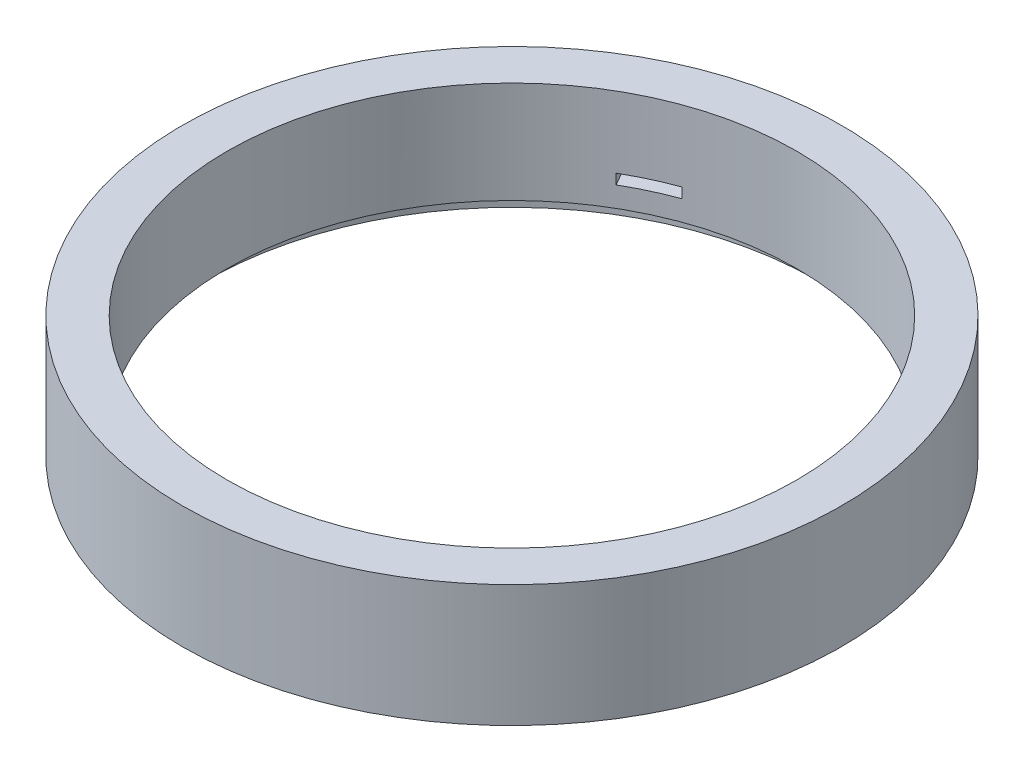
ISO-10303-21;
HEADER;
FILE_DESCRIPTION(('STEP AP214'),'2;1');
FILE_NAME('part.step','',(''),(''),'','','');
FILE_SCHEMA(('AUTOMOTIVE_DESIGN { 1 0 10303 214 1 1 1 1 }'));
ENDSEC;
DATA;
#1=APPLICATION_CONTEXT('core data for automotive mechanical design processes');
#2=APPLICATION_PROTOCOL_DEFINITION('international standard','automotive_design',2000,#1);
#3=PRODUCT_CONTEXT('',#1,'mechanical');
#4=PRODUCT('Part','Part','',(#3));
#5=PRODUCT_RELATED_PRODUCT_CATEGORY('part','',(#4));
#6=PRODUCT_DEFINITION_FORMATION('','',#4);
#7=PRODUCT_DEFINITION_CONTEXT('part definition',#1,'design');
#8=PRODUCT_DEFINITION('design','',#6,#7);
#9=PRODUCT_DEFINITION_SHAPE('','',#8);
#10=(LENGTH_UNIT() NAMED_UNIT(*) SI_UNIT(.MILLI.,.METRE.));
#11=(NAMED_UNIT(*) PLANE_ANGLE_UNIT() SI_UNIT($,.RADIAN.));
#12=(NAMED_UNIT(*) SI_UNIT($,.STERADIAN.) SOLID_ANGLE_UNIT());
#13=UNCERTAINTY_MEASURE_WITH_UNIT(LENGTH_MEASURE(1.E-05),#10,'distance_accuracy_value','');
#14=(GEOMETRIC_REPRESENTATION_CONTEXT(3) GLOBAL_UNCERTAINTY_ASSIGNED_CONTEXT((#13)) GLOBAL_UNIT_ASSIGNED_CONTEXT((#10,
#11,#12)) REPRESENTATION_CONTEXT('',''));
#15=CARTESIAN_POINT('',(0.,0.,0.));
#16=DIRECTION('',(0.,0.,1.));
#17=DIRECTION('',(1.,0.,0.));
#18=AXIS2_PLACEMENT_3D('',#15,#16,#17);
#19=CARTESIAN_POINT('',(0.,15.,0.));
#20=DIRECTION('',(0.,-1.,0.));
#21=DIRECTION('',(0.,0.,-1.));
#22=AXIS2_PLACEMENT_3D('',#19,#20,#21);
#23=CYLINDRICAL_SURFACE('',#22,70.);
#24=DIRECTION('',(0.,-1.,0.));
#25=VECTOR('',#24,1.);
#26=CARTESIAN_POINT('',(-35.0000000000003,15.,-60.6217782649106));
#27=LINE('',#26,#25);
#28=CARTESIAN_POINT('',(-35.0000000000003,-2.50000000000001,-60.6217782649106));
#29=VERTEX_POINT('',#28);
#30=CARTESIAN_POINT('',(-35.0000000000003,-5.00000000000001,-60.6217782649106));
#31=VERTEX_POINT('',#30);
#32=EDGE_CURVE('E139',#29,#31,#27,.T.);
#33=ORIENTED_EDGE('',*,*,#32,.F.);
#34=CARTESIAN_POINT('',(0.,-2.50000000000001,0.));
#35=DIRECTION('',(0.,-1.,0.));
#36=DIRECTION('',(-0.866025403784436,0.,0.500000000000004));
#37=AXIS2_PLACEMENT_3D('',#34,#35,#36);
#38=CIRCLE('',#37,70.);
#39=CARTESIAN_POINT('',(-23.9414100327971,-2.50000000000001,-65.7784834550135));
#40=VERTEX_POINT('',#39);
#41=EDGE_CURVE('E64',#29,#40,#38,.T.);
#42=ORIENTED_EDGE('',*,*,#41,.T.);
#43=DIRECTION('',(0.,-1.,0.));
#44=VECTOR('',#43,1.);
#45=CARTESIAN_POINT('',(-23.9414100327971,15.,-65.7784834550135));
#46=LINE('',#45,#44);
#47=CARTESIAN_POINT('',(-23.9414100327971,-5.00000000000001,-65.7784834550135));
#48=VERTEX_POINT('',#47);
#49=EDGE_CURVE('E162',#40,#48,#46,.T.);
#50=ORIENTED_EDGE('',*,*,#49,.T.);
#51=CARTESIAN_POINT('',(0.,-5.00000000000001,0.));
#52=DIRECTION('',(0.,1.,0.));
#53=DIRECTION('',(0.866025403784436,0.,-0.500000000000004));
#54=AXIS2_PLACEMENT_3D('',#51,#52,#53);
#55=CIRCLE('',#54,70.);
#56=EDGE_CURVE('E153',#48,#31,#55,.T.);
#57=ORIENTED_EDGE('',*,*,#56,.T.);
#58=EDGE_LOOP('',(#33,#42,#50,#57));
#59=FACE_BOUND('',#58,.T.);
#60=DIRECTION('',(0.,-1.,0.));
#61=VECTOR('',#60,1.);
#62=CARTESIAN_POINT('',(-34.9999999999994,15.,60.621778264911));
#63=LINE('',#62,#61);
#64=CARTESIAN_POINT('',(-34.9999999999994,-2.50000000000001,60.621778264911));
#65=VERTEX_POINT('',#64);
#66=CARTESIAN_POINT('',(-34.9999999999994,-5.00000000000001,60.621778264911));
#67=VERTEX_POINT('',#66);
#68=EDGE_CURVE('E186',#65,#67,#63,.T.);
#69=ORIENTED_EDGE('',*,*,#68,.F.);
#70=CARTESIAN_POINT('',(0.,-2.50000000000001,0.));
#71=DIRECTION('',(0.,-1.,0.));
#72=DIRECTION('',(0.866025403784443,0.,0.499999999999992));
#73=AXIS2_PLACEMENT_3D('',#70,#71,#72);
#74=CIRCLE('',#73,70.);
#75=CARTESIAN_POINT('',(-44.9951326780573,-2.50000000000001,53.6231110183289));
#76=VERTEX_POINT('',#75);
#77=EDGE_CURVE('E72',#65,#76,#74,.T.);
#78=ORIENTED_EDGE('',*,*,#77,.T.);
#79=DIRECTION('',(0.,-1.,0.));
#80=VECTOR('',#79,1.);
#81=CARTESIAN_POINT('',(-44.9951326780573,15.,53.6231110183289));
#82=LINE('',#81,#80);
#83=CARTESIAN_POINT('',(-44.9951326780573,-5.00000000000001,53.6231110183289));
#84=VERTEX_POINT('',#83);
#85=EDGE_CURVE('E216',#76,#84,#82,.T.);
#86=ORIENTED_EDGE('',*,*,#85,.T.);
#87=CARTESIAN_POINT('',(0.,-5.00000000000001,0.));
#88=DIRECTION('',(0.,1.,0.));
#89=DIRECTION('',(-0.866025403784443,0.,-0.499999999999992));
#90=AXIS2_PLACEMENT_3D('',#87,#88,#89);
#91=CIRCLE('',#90,70.);
#92=EDGE_CURVE('E205',#84,#67,#91,.T.);
#93=ORIENTED_EDGE('',*,*,#92,.T.);
#94=EDGE_LOOP('',(#69,#78,#86,#93));
#95=FACE_BOUND('',#94,.T.);
#96=CARTESIAN_POINT('',(0.,-2.50000000000001,0.));
#97=DIRECTION('',(0.,-1.,0.));
#98=DIRECTION('',(0.,0.,-1.));
#99=AXIS2_PLACEMENT_3D('',#96,#97,#98);
#100=CIRCLE('',#99,70.);
#101=CARTESIAN_POINT('',(70.,-2.50000000000001,0.));
#102=VERTEX_POINT('',#101);
#103=CARTESIAN_POINT('',(68.9365427108546,-2.50000000000001,12.1553724366852));
#104=VERTEX_POINT('',#103);
#105=EDGE_CURVE('E57',#102,#104,#100,.T.);
#106=ORIENTED_EDGE('',*,*,#105,.T.);
#107=DIRECTION('',(0.,-1.,0.));
#108=VECTOR('',#107,1.);
#109=CARTESIAN_POINT('',(68.9365427108546,15.,12.1553724366852));
#110=LINE('',#109,#108);
#111=CARTESIAN_POINT('',(68.9365427108546,-5.00000000000001,12.1553724366852));
#112=VERTEX_POINT('',#111);
#113=EDGE_CURVE('E11',#104,#112,#110,.T.);
#114=ORIENTED_EDGE('',*,*,#113,.T.);
#115=CARTESIAN_POINT('',(0.,-5.00000000000001,0.));
#116=DIRECTION('',(0.,1.,0.));
#117=DIRECTION('',(0.,0.,1.));
#118=AXIS2_PLACEMENT_3D('',#115,#116,#117);
#119=CIRCLE('',#118,70.);
#120=CARTESIAN_POINT('',(70.,-5.00000000000001,0.));
#121=VERTEX_POINT('',#120);
#122=EDGE_CURVE('E268',#112,#121,#119,.T.);
#123=ORIENTED_EDGE('',*,*,#122,.T.);
#124=DIRECTION('',(0.,-1.,0.));
#125=VECTOR('',#124,1.);
#126=CARTESIAN_POINT('',(70.,15.,0.));
#127=LINE('',#126,#125);
#128=EDGE_CURVE('E262',#102,#121,#127,.T.);
#129=ORIENTED_EDGE('',*,*,#128,.F.);
#130=EDGE_LOOP('',(#106,#114,#123,#129));
#131=FACE_BOUND('',#130,.T.);
#132=CARTESIAN_POINT('',(0.,15.,0.));
#133=DIRECTION('',(0.,1.,0.));
#134=DIRECTION('',(0.,0.,1.));
#135=AXIS2_PLACEMENT_3D('',#132,#133,#134);
#136=CIRCLE('',#135,70.);
#137=CARTESIAN_POINT('',(0.,15.,70.));
#138=VERTEX_POINT('',#137);
#139=EDGE_CURVE('E253',#138,#138,#136,.T.);
#140=ORIENTED_EDGE('',*,*,#139,.T.);
#141=EDGE_LOOP('',(#140));
#142=FACE_BOUND('',#141,.T.);
#143=CARTESIAN_POINT('',(0.,-10.,0.));
#144=DIRECTION('',(0.,-1.,0.));
#145=DIRECTION('',(0.,0.,-1.));
#146=AXIS2_PLACEMENT_3D('',#143,#144,#145);
#147=CIRCLE('',#146,70.);
#148=CARTESIAN_POINT('',(0.,-10.,-70.));
#149=VERTEX_POINT('',#148);
#150=EDGE_CURVE('E51',#149,#149,#147,.T.);
#151=ORIENTED_EDGE('',*,*,#150,.T.);
#152=EDGE_LOOP('',(#151));
#153=FACE_BOUND('',#152,.T.);
#154=ADVANCED_FACE('F47',(#59,#95,#131,#142,#153),#23,.F.);
#155=CARTESIAN_POINT('',(0.,15.,0.));
#156=DIRECTION('',(0.,1.,0.));
#157=DIRECTION('',(0.,0.,1.));
#158=AXIS2_PLACEMENT_3D('',#155,#156,#157);
#159=PLANE('',#158);
#160=CARTESIAN_POINT('',(0.,15.,0.));
#161=DIRECTION('',(0.,1.,0.));
#162=DIRECTION('',(0.,0.,1.));
#163=AXIS2_PLACEMENT_3D('',#160,#161,#162);
#164=CIRCLE('',#163,81.);
#165=CARTESIAN_POINT('',(0.,15.,81.));
#166=VERTEX_POINT('',#165);
#167=EDGE_CURVE('E258',#166,#166,#164,.T.);
#168=ORIENTED_EDGE('',*,*,#167,.T.);
#169=EDGE_LOOP('',(#168));
#170=FACE_BOUND('',#169,.T.);
#171=ORIENTED_EDGE('',*,*,#139,.F.);
#172=EDGE_LOOP('',(#171));
#173=FACE_BOUND('',#172,.T.);
#174=ADVANCED_FACE('F306',(#170,#173),#159,.T.);
#175=CARTESIAN_POINT('',(0.,-15.,0.));
#176=DIRECTION('',(0.,1.,0.));
#177=DIRECTION('',(0.,0.,1.));
#178=AXIS2_PLACEMENT_3D('',#175,#176,#177);
#179=PLANE('',#178);
#180=CARTESIAN_POINT('',(0.,-15.,0.));
#181=DIRECTION('',(0.,-1.,0.));
#182=DIRECTION('',(0.,0.,-1.));
#183=AXIS2_PLACEMENT_3D('',#180,#181,#182);
#184=CIRCLE('',#183,75.);
#185=CARTESIAN_POINT('',(0.,-15.,-75.));
#186=VERTEX_POINT('',#185);
#187=EDGE_CURVE('E325',#186,#186,#184,.T.);
#188=ORIENTED_EDGE('',*,*,#187,.F.);
#189=EDGE_LOOP('',(#188));
#190=FACE_BOUND('',#189,.T.);
#191=CARTESIAN_POINT('',(0.,-15.,0.));
#192=DIRECTION('',(0.,1.,0.));
#193=DIRECTION('',(0.,0.,1.));
#194=AXIS2_PLACEMENT_3D('',#191,#192,#193);
#195=CIRCLE('',#194,81.);
#196=CARTESIAN_POINT('',(0.,-15.,81.));
#197=VERTEX_POINT('',#196);
#198=EDGE_CURVE('E257',#197,#197,#195,.T.);
#199=ORIENTED_EDGE('',*,*,#198,.F.);
#200=EDGE_LOOP('',(#199));
#201=FACE_BOUND('',#200,.T.);
#202=ADVANCED_FACE('F311',(#190,#201),#179,.F.);
#203=CARTESIAN_POINT('',(0.,15.,0.));
#204=DIRECTION('',(0.,-1.,0.));
#205=DIRECTION('',(0.,0.,-1.));
#206=AXIS2_PLACEMENT_3D('',#203,#204,#205);
#207=CYLINDRICAL_SURFACE('',#206,81.);
#208=ORIENTED_EDGE('',*,*,#167,.F.);
#209=EDGE_LOOP('',(#208));
#210=FACE_BOUND('',#209,.T.);
#211=ORIENTED_EDGE('',*,*,#198,.T.);
#212=EDGE_LOOP('',(#211));
#213=FACE_BOUND('',#212,.T.);
#214=ADVANCED_FACE('F49',(#210,#213),#207,.T.);
#215=CARTESIAN_POINT('',(68.9349764855042,-2.50000000000001,12.155096268898));
#216=DIRECTION('',(0.,-1.,0.));
#217=DIRECTION('',(0.,0.,-1.));
#218=AXIS2_PLACEMENT_3D('',#215,#216,#217);
#219=PLANE('',#218);
#220=DIRECTION('',(-1.,0.,0.));
#221=VECTOR('',#220,1.);
#222=CARTESIAN_POINT('',(69.998409613099,-2.50000000000001,0.));
#223=LINE('',#222,#221);
#224=CARTESIAN_POINT('',(74.998409613099,-2.50000000000001,0.));
#225=VERTEX_POINT('',#224);
#226=EDGE_CURVE('E232',#225,#102,#223,.T.);
#227=ORIENTED_EDGE('',*,*,#226,.F.);
#228=CARTESIAN_POINT('',(0.,-2.50000000000001,0.));
#229=DIRECTION('',(0.,1.,0.));
#230=DIRECTION('',(0.,0.,1.));
#231=AXIS2_PLACEMENT_3D('',#228,#229,#230);
#232=CIRCLE('',#231,74.998409613099);
#233=CARTESIAN_POINT('',(73.8590152505652,-2.50000000000001,13.0233371572327));
#234=VERTEX_POINT('',#233);
#235=EDGE_CURVE('E250',#234,#225,#232,.T.);
#236=ORIENTED_EDGE('',*,*,#235,.F.);
#237=DIRECTION('',(-0.984807753012208,0.,-0.173648177666931));
#238=VECTOR('',#237,1.);
#239=CARTESIAN_POINT('',(68.9349764855042,-2.50000000000001,12.155096268898));
#240=LINE('',#239,#238);
#241=EDGE_CURVE('E242',#234,#104,#240,.T.);
#242=ORIENTED_EDGE('',*,*,#241,.T.);
#243=ORIENTED_EDGE('',*,*,#105,.F.);
#244=EDGE_LOOP('',(#227,#236,#242,#243));
#245=FACE_BOUND('',#244,.T.);
#246=ADVANCED_FACE('F280',(#245),#219,.T.);
#247=CARTESIAN_POINT('',(0.,15.,0.));
#248=DIRECTION('',(0.,1.,0.));
#249=DIRECTION('',(0.,0.,1.));
#250=AXIS2_PLACEMENT_3D('',#247,#248,#249);
#251=CYLINDRICAL_SURFACE('',#250,74.998409613099);
#252=CARTESIAN_POINT('',(0.,-5.00000000000001,0.));
#253=DIRECTION('',(0.,1.,0.));
#254=DIRECTION('',(0.,0.,1.));
#255=AXIS2_PLACEMENT_3D('',#252,#253,#254);
#256=CIRCLE('',#255,74.998409613099);
#257=CARTESIAN_POINT('',(73.8590152505652,-5.00000000000001,13.0233371572327));
#258=VERTEX_POINT('',#257);
#259=CARTESIAN_POINT('',(74.998409613099,-5.00000000000001,0.));
#260=VERTEX_POINT('',#259);
#261=EDGE_CURVE('E246',#258,#260,#256,.T.);
#262=ORIENTED_EDGE('',*,*,#261,.F.);
#263=DIRECTION('',(0.,1.,0.));
#264=VECTOR('',#263,1.);
#265=CARTESIAN_POINT('',(73.8590152505652,-5.00000000000001,13.0233371572327));
#266=LINE('',#265,#264);
#267=EDGE_CURVE('E238',#258,#234,#266,.T.);
#268=ORIENTED_EDGE('',*,*,#267,.T.);
#269=ORIENTED_EDGE('',*,*,#235,.T.);
#270=DIRECTION('',(0.,1.,0.));
#271=VECTOR('',#270,1.);
#272=CARTESIAN_POINT('',(74.998409613099,-5.00000000000001,0.));
#273=LINE('',#272,#271);
#274=EDGE_CURVE('E228',#260,#225,#273,.T.);
#275=ORIENTED_EDGE('',*,*,#274,.F.);
#276=EDGE_LOOP('',(#262,#268,#269,#275));
#277=FACE_BOUND('',#276,.T.);
#278=ADVANCED_FACE('F292',(#277),#251,.F.);
#279=CARTESIAN_POINT('',(68.9349764855042,-5.00000000000001,12.155096268898));
#280=DIRECTION('',(0.,1.,0.));
#281=DIRECTION('',(0.,0.,1.));
#282=AXIS2_PLACEMENT_3D('',#279,#280,#281);
#283=PLANE('',#282);
#284=DIRECTION('',(0.984807753012208,0.,0.173648177666931));
#285=VECTOR('',#284,1.);
#286=CARTESIAN_POINT('',(68.9349764855042,-5.00000000000001,12.155096268898));
#287=LINE('',#286,#285);
#288=EDGE_CURVE('E235',#112,#258,#287,.T.);
#289=ORIENTED_EDGE('',*,*,#288,.T.);
#290=ORIENTED_EDGE('',*,*,#261,.T.);
#291=DIRECTION('',(1.,0.,0.));
#292=VECTOR('',#291,1.);
#293=CARTESIAN_POINT('',(69.998409613099,-5.00000000000001,0.));
#294=LINE('',#293,#292);
#295=EDGE_CURVE('E185',#121,#260,#294,.T.);
#296=ORIENTED_EDGE('',*,*,#295,.F.);
#297=ORIENTED_EDGE('',*,*,#122,.F.);
#298=EDGE_LOOP('',(#289,#290,#296,#297));
#299=FACE_BOUND('',#298,.T.);
#300=ADVANCED_FACE('F288',(#299),#283,.T.);
#301=CARTESIAN_POINT('',(0.,0.,0.));
#302=DIRECTION('',(0.173648177666931,0.,-0.984807753012208));
#303=DIRECTION('',(-0.984807753012208,0.,-0.173648177666931));
#304=AXIS2_PLACEMENT_3D('',#301,#302,#303);
#305=PLANE('',#304);
#306=ORIENTED_EDGE('',*,*,#241,.F.);
#307=ORIENTED_EDGE('',*,*,#267,.F.);
#308=ORIENTED_EDGE('',*,*,#288,.F.);
#309=ORIENTED_EDGE('',*,*,#113,.F.);
#310=EDGE_LOOP('',(#306,#307,#308,#309));
#311=FACE_BOUND('',#310,.T.);
#312=ADVANCED_FACE('F284',(#311),#305,.T.);
#313=CARTESIAN_POINT('',(0.,0.,0.));
#314=DIRECTION('',(0.,0.,-1.));
#315=DIRECTION('',(-1.,0.,0.));
#316=AXIS2_PLACEMENT_3D('',#313,#314,#315);
#317=PLANE('',#316);
#318=ORIENTED_EDGE('',*,*,#128,.T.);
#319=ORIENTED_EDGE('',*,*,#295,.T.);
#320=ORIENTED_EDGE('',*,*,#274,.T.);
#321=ORIENTED_EDGE('',*,*,#226,.T.);
#322=EDGE_LOOP('',(#318,#319,#320,#321));
#323=FACE_BOUND('',#322,.T.);
#324=ADVANCED_FACE('F294',(#323),#317,.F.);
#325=CARTESIAN_POINT('',(-44.9941103970627,-2.50000000000001,53.621892711281));
#326=DIRECTION('',(0.,-1.,0.));
#327=DIRECTION('',(0.866025403784443,0.,0.499999999999992));
#328=AXIS2_PLACEMENT_3D('',#325,#326,#327);
#329=PLANE('',#328);
#330=DIRECTION('',(0.499999999999992,0.,-0.866025403784443));
#331=VECTOR('',#330,1.);
#332=CARTESIAN_POINT('',(-34.999204806549,-2.50000000000001,60.620400949453));
#333=LINE('',#332,#331);
#334=CARTESIAN_POINT('',(-37.4992048065489,-2.50000000000001,64.9505279683752));
#335=VERTEX_POINT('',#334);
#336=EDGE_CURVE('E195',#335,#65,#333,.T.);
#337=ORIENTED_EDGE('',*,*,#336,.F.);
#338=CARTESIAN_POINT('',(0.,-2.50000000000001,0.));
#339=DIRECTION('',(0.,1.,0.));
#340=DIRECTION('',(-0.866025403784443,0.,-0.499999999999992));
#341=AXIS2_PLACEMENT_3D('',#338,#339,#340);
#342=CIRCLE('',#341,74.998409613099);
#343=CARTESIAN_POINT('',(-48.2080484454954,-2.50000000000001,57.4521149268759));
#344=VERTEX_POINT('',#343);
#345=EDGE_CURVE('E220',#344,#335,#342,.T.);
#346=ORIENTED_EDGE('',*,*,#345,.F.);
#347=DIRECTION('',(0.642787609686532,0.,-0.766044443118984));
#348=VECTOR('',#347,1.);
#349=CARTESIAN_POINT('',(-44.9941103970627,-2.50000000000001,53.621892711281));
#350=LINE('',#349,#348);
#351=EDGE_CURVE('E209',#344,#76,#350,.T.);
#352=ORIENTED_EDGE('',*,*,#351,.T.);
#353=ORIENTED_EDGE('',*,*,#77,.F.);
#354=EDGE_LOOP('',(#337,#346,#352,#353));
#355=FACE_BOUND('',#354,.T.);
#356=ADVANCED_FACE('F296',(#355),#329,.T.);
#357=CARTESIAN_POINT('',(0.,15.,0.));
#358=DIRECTION('',(0.,1.,0.));
#359=DIRECTION('',(-0.866025403784443,0.,-0.499999999999992));
#360=AXIS2_PLACEMENT_3D('',#357,#358,#359);
#361=CYLINDRICAL_SURFACE('',#360,74.998409613099);
#362=CARTESIAN_POINT('',(0.,-5.00000000000001,0.));
#363=DIRECTION('',(0.,1.,0.));
#364=DIRECTION('',(-0.866025403784443,0.,-0.499999999999992));
#365=AXIS2_PLACEMENT_3D('',#362,#363,#364);
#366=CIRCLE('',#365,74.998409613099);
#367=CARTESIAN_POINT('',(-48.2080484454954,-5.00000000000001,57.4521149268759));
#368=VERTEX_POINT('',#367);
#369=CARTESIAN_POINT('',(-37.4992048065489,-5.00000000000001,64.9505279683752));
#370=VERTEX_POINT('',#369);
#371=EDGE_CURVE('E201',#368,#370,#366,.T.);
#372=ORIENTED_EDGE('',*,*,#371,.F.);
#373=DIRECTION('',(0.,1.,0.));
#374=VECTOR('',#373,1.);
#375=CARTESIAN_POINT('',(-48.2080484454954,-5.00000000000001,57.4521149268759));
#376=LINE('',#375,#374);
#377=EDGE_CURVE('E212',#368,#344,#376,.T.);
#378=ORIENTED_EDGE('',*,*,#377,.T.);
#379=ORIENTED_EDGE('',*,*,#345,.T.);
#380=DIRECTION('',(0.,1.,0.));
#381=VECTOR('',#380,1.);
#382=CARTESIAN_POINT('',(-37.4992048065489,-5.00000000000001,64.9505279683752));
#383=LINE('',#382,#381);
#384=EDGE_CURVE('E192',#370,#335,#383,.T.);
#385=ORIENTED_EDGE('',*,*,#384,.F.);
#386=EDGE_LOOP('',(#372,#378,#379,#385));
#387=FACE_BOUND('',#386,.T.);
#388=ADVANCED_FACE('F302',(#387),#361,.F.);
#389=CARTESIAN_POINT('',(0.,0.,0.));
#390=DIRECTION('',(0.766044443118984,0.,0.642787609686532));
#391=DIRECTION('',(0.642787609686532,0.,-0.766044443118984));
#392=AXIS2_PLACEMENT_3D('',#389,#390,#391);
#393=PLANE('',#392);
#394=ORIENTED_EDGE('',*,*,#351,.F.);
#395=ORIENTED_EDGE('',*,*,#377,.F.);
#396=DIRECTION('',(-0.642787609686532,0.,0.766044443118984));
#397=VECTOR('',#396,1.);
#398=CARTESIAN_POINT('',(-44.9941103970627,-5.00000000000001,53.621892711281));
#399=LINE('',#398,#397);
#400=EDGE_CURVE('E198',#84,#368,#399,.T.);
#401=ORIENTED_EDGE('',*,*,#400,.F.);
#402=ORIENTED_EDGE('',*,*,#85,.F.);
#403=EDGE_LOOP('',(#394,#395,#401,#402));
#404=FACE_BOUND('',#403,.T.);
#405=ADVANCED_FACE('F362',(#404),#393,.T.);
#406=CARTESIAN_POINT('',(-44.9941103970627,-5.00000000000001,53.621892711281));
#407=DIRECTION('',(0.,1.,0.));
#408=DIRECTION('',(-0.866025403784443,0.,-0.499999999999992));
#409=AXIS2_PLACEMENT_3D('',#406,#407,#408);
#410=PLANE('',#409);
#411=ORIENTED_EDGE('',*,*,#400,.T.);
#412=ORIENTED_EDGE('',*,*,#371,.T.);
#413=DIRECTION('',(-0.499999999999992,0.,0.866025403784443));
#414=VECTOR('',#413,1.);
#415=CARTESIAN_POINT('',(-34.999204806549,-5.00000000000001,60.620400949453));
#416=LINE('',#415,#414);
#417=EDGE_CURVE('E189',#67,#370,#416,.T.);
#418=ORIENTED_EDGE('',*,*,#417,.F.);
#419=ORIENTED_EDGE('',*,*,#92,.F.);
#420=EDGE_LOOP('',(#411,#412,#418,#419));
#421=FACE_BOUND('',#420,.T.);
#422=ADVANCED_FACE('F355',(#421),#410,.T.);
#423=CARTESIAN_POINT('',(0.,0.,0.));
#424=DIRECTION('',(0.866025403784443,0.,0.499999999999992));
#425=DIRECTION('',(0.499999999999992,0.,-0.866025403784443));
#426=AXIS2_PLACEMENT_3D('',#423,#424,#425);
#427=PLANE('',#426);
#428=ORIENTED_EDGE('',*,*,#68,.T.);
#429=ORIENTED_EDGE('',*,*,#417,.T.);
#430=ORIENTED_EDGE('',*,*,#384,.T.);
#431=ORIENTED_EDGE('',*,*,#336,.T.);
#432=EDGE_LOOP('',(#428,#429,#430,#431));
#433=FACE_BOUND('',#432,.T.);
#434=ADVANCED_FACE('F348',(#433),#427,.F.);
#435=CARTESIAN_POINT('',(-23.9408660884413,-2.50000000000001,-65.7769889801785));
#436=DIRECTION('',(0.,-1.,0.));
#437=DIRECTION('',(-0.866025403784436,0.,0.500000000000004));
#438=AXIS2_PLACEMENT_3D('',#435,#436,#437);
#439=PLANE('',#438);
#440=DIRECTION('',(0.500000000000004,0.,0.866025403784436));
#441=VECTOR('',#440,1.);
#442=CARTESIAN_POINT('',(-34.9992048065498,-2.50000000000001,-60.6204009494525));
#443=LINE('',#442,#441);
#444=CARTESIAN_POINT('',(-37.4992048065498,-2.50000000000001,-64.9505279683747));
#445=VERTEX_POINT('',#444);
#446=EDGE_CURVE('E144',#445,#29,#443,.T.);
#447=ORIENTED_EDGE('',*,*,#446,.F.);
#448=CARTESIAN_POINT('',(0.,-2.50000000000001,0.));
#449=DIRECTION('',(0.,1.,0.));
#450=DIRECTION('',(0.866025403784436,0.,-0.500000000000004));
#451=AXIS2_PLACEMENT_3D('',#448,#449,#450);
#452=CIRCLE('',#451,74.998409613099);
#453=CARTESIAN_POINT('',(-25.6509668050697,-2.50000000000001,-70.475452084108));
#454=VERTEX_POINT('',#453);
#455=EDGE_CURVE('E179',#454,#445,#452,.T.);
#456=ORIENTED_EDGE('',*,*,#455,.F.);
#457=DIRECTION('',(0.342020143325673,0.,0.939692620785907));
#458=VECTOR('',#457,1.);
#459=CARTESIAN_POINT('',(-23.9408660884413,-2.50000000000001,-65.7769889801785));
#460=LINE('',#459,#458);
#461=EDGE_CURVE('E164',#454,#40,#460,.T.);
#462=ORIENTED_EDGE('',*,*,#461,.T.);
#463=ORIENTED_EDGE('',*,*,#41,.F.);
#464=EDGE_LOOP('',(#447,#456,#462,#463));
#465=FACE_BOUND('',#464,.T.);
#466=ADVANCED_FACE('F346',(#465),#439,.T.);
#467=CARTESIAN_POINT('',(0.,15.,0.));
#468=DIRECTION('',(0.,1.,0.));
#469=DIRECTION('',(0.866025403784436,0.,-0.500000000000004));
#470=AXIS2_PLACEMENT_3D('',#467,#468,#469);
#471=CYLINDRICAL_SURFACE('',#470,74.998409613099);
#472=CARTESIAN_POINT('',(0.,-5.00000000000001,0.));
#473=DIRECTION('',(0.,1.,0.));
#474=DIRECTION('',(0.866025403784436,0.,-0.500000000000004));
#475=AXIS2_PLACEMENT_3D('',#472,#473,#474);
#476=CIRCLE('',#475,74.998409613099);
#477=CARTESIAN_POINT('',(-25.6509668050697,-5.00000000000001,-70.475452084108));
#478=VERTEX_POINT('',#477);
#479=CARTESIAN_POINT('',(-37.4992048065498,-5.00000000000001,-64.9505279683747));
#480=VERTEX_POINT('',#479);
#481=EDGE_CURVE('E156',#478,#480,#476,.T.);
#482=ORIENTED_EDGE('',*,*,#481,.F.);
#483=DIRECTION('',(0.,1.,0.));
#484=VECTOR('',#483,1.);
#485=CARTESIAN_POINT('',(-25.6509668050697,-5.00000000000001,-70.475452084108));
#486=LINE('',#485,#484);
#487=EDGE_CURVE('E168',#478,#454,#486,.T.);
#488=ORIENTED_EDGE('',*,*,#487,.T.);
#489=ORIENTED_EDGE('',*,*,#455,.T.);
#490=DIRECTION('',(0.,1.,0.));
#491=VECTOR('',#490,1.);
#492=CARTESIAN_POINT('',(-37.4992048065498,-5.00000000000001,-64.9505279683747));
#493=LINE('',#492,#491);
#494=EDGE_CURVE('E158',#480,#445,#493,.T.);
#495=ORIENTED_EDGE('',*,*,#494,.F.);
#496=EDGE_LOOP('',(#482,#488,#489,#495));
#497=FACE_BOUND('',#496,.T.);
#498=ADVANCED_FACE('F343',(#497),#471,.F.);
#499=CARTESIAN_POINT('',(0.,0.,0.));
#500=DIRECTION('',(-0.939692620785907,0.,0.342020143325673));
#501=DIRECTION('',(0.342020143325673,0.,0.939692620785907));
#502=AXIS2_PLACEMENT_3D('',#499,#500,#501);
#503=PLANE('',#502);
#504=ORIENTED_EDGE('',*,*,#461,.F.);
#505=ORIENTED_EDGE('',*,*,#487,.F.);
#506=DIRECTION('',(-0.342020143325673,0.,-0.939692620785907));
#507=VECTOR('',#506,1.);
#508=CARTESIAN_POINT('',(-23.9408660884413,-5.00000000000001,-65.7769889801785));
#509=LINE('',#508,#507);
#510=EDGE_CURVE('E170',#48,#478,#509,.T.);
#511=ORIENTED_EDGE('',*,*,#510,.F.);
#512=ORIENTED_EDGE('',*,*,#49,.F.);
#513=EDGE_LOOP('',(#504,#505,#511,#512));
#514=FACE_BOUND('',#513,.T.);
#515=ADVANCED_FACE('F345',(#514),#503,.T.);
#516=CARTESIAN_POINT('',(-23.9408660884413,-5.00000000000001,-65.7769889801785));
#517=DIRECTION('',(0.,1.,0.));
#518=DIRECTION('',(0.866025403784436,0.,-0.500000000000004));
#519=AXIS2_PLACEMENT_3D('',#516,#517,#518);
#520=PLANE('',#519);
#521=ORIENTED_EDGE('',*,*,#510,.T.);
#522=ORIENTED_EDGE('',*,*,#481,.T.);
#523=DIRECTION('',(-0.500000000000004,0.,-0.866025403784436));
#524=VECTOR('',#523,1.);
#525=CARTESIAN_POINT('',(-34.9992048065498,-5.00000000000001,-60.6204009494525));
#526=LINE('',#525,#524);
#527=EDGE_CURVE('E142',#31,#480,#526,.T.);
#528=ORIENTED_EDGE('',*,*,#527,.F.);
#529=ORIENTED_EDGE('',*,*,#56,.F.);
#530=EDGE_LOOP('',(#521,#522,#528,#529));
#531=FACE_BOUND('',#530,.T.);
#532=ADVANCED_FACE('F152',(#531),#520,.T.);
#533=CARTESIAN_POINT('',(0.,0.,0.));
#534=DIRECTION('',(-0.866025403784436,0.,0.500000000000004));
#535=DIRECTION('',(0.500000000000004,0.,0.866025403784436));
#536=AXIS2_PLACEMENT_3D('',#533,#534,#535);
#537=PLANE('',#536);
#538=ORIENTED_EDGE('',*,*,#32,.T.);
#539=ORIENTED_EDGE('',*,*,#527,.T.);
#540=ORIENTED_EDGE('',*,*,#494,.T.);
#541=ORIENTED_EDGE('',*,*,#446,.T.);
#542=EDGE_LOOP('',(#538,#539,#540,#541));
#543=FACE_BOUND('',#542,.T.);
#544=ADVANCED_FACE('F141',(#543),#537,.F.);
#545=CARTESIAN_POINT('',(0.,-10.,0.));
#546=DIRECTION('',(0.,-1.,0.));
#547=DIRECTION('',(0.,0.,-1.));
#548=AXIS2_PLACEMENT_3D('',#545,#546,#547);
#549=CYLINDRICAL_SURFACE('',#548,75.);
#550=CARTESIAN_POINT('',(0.,-10.,0.));
#551=DIRECTION('',(0.,-1.,0.));
#552=DIRECTION('',(0.,0.,-1.));
#553=AXIS2_PLACEMENT_3D('',#550,#551,#552);
#554=CIRCLE('',#553,75.);
#555=CARTESIAN_POINT('',(0.,-10.,-75.));
#556=VERTEX_POINT('',#555);
#557=EDGE_CURVE('E330',#556,#556,#554,.T.);
#558=ORIENTED_EDGE('',*,*,#557,.F.);
#559=EDGE_LOOP('',(#558));
#560=FACE_BOUND('',#559,.T.);
#561=ORIENTED_EDGE('',*,*,#187,.T.);
#562=EDGE_LOOP('',(#561));
#563=FACE_BOUND('',#562,.T.);
#564=ADVANCED_FACE('F421',(#560,#563),#549,.F.);
#565=CARTESIAN_POINT('',(0.,-10.,0.));
#566=DIRECTION('',(0.,-1.,0.));
#567=DIRECTION('',(0.,0.,-1.));
#568=AXIS2_PLACEMENT_3D('',#565,#566,#567);
#569=PLANE('',#568);
#570=ORIENTED_EDGE('',*,*,#150,.F.);
#571=EDGE_LOOP('',(#570));
#572=FACE_BOUND('',#571,.T.);
#573=ORIENTED_EDGE('',*,*,#557,.T.);
#574=EDGE_LOOP('',(#573));
#575=FACE_BOUND('',#574,.T.);
#576=ADVANCED_FACE('F426',(#572,#575),#569,.T.);
#577=CLOSED_SHELL('',(#154,#174,#202,#214,#246,#278,#300,#312,#324,#356,#388,#405,#422,#434,
#466,#498,#515,#532,#544,#564,#576));
#578=MANIFOLD_SOLID_BREP('B2',#577);
#579=ADVANCED_BREP_SHAPE_REPRESENTATION('',(#18,#578),#14);
#580=SHAPE_DEFINITION_REPRESENTATION(#9,#579);
ENDSEC;
END-ISO-10303-21;
